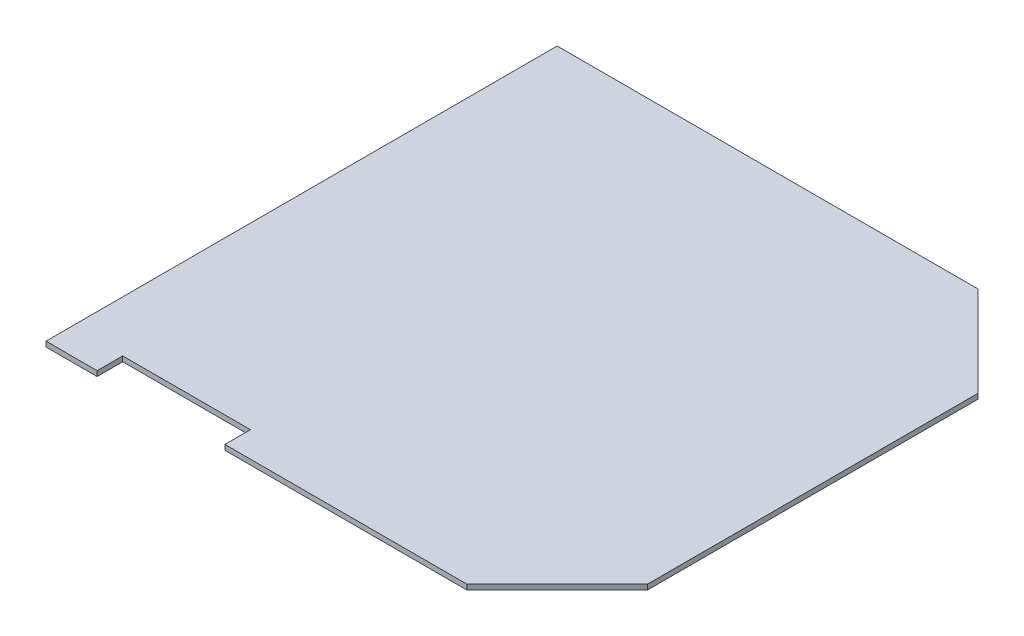
ISO-10303-21;
HEADER;
FILE_DESCRIPTION(('STEP AP214'),'2;1');
FILE_NAME('part.step','',(''),(''),'','','');
FILE_SCHEMA(('AUTOMOTIVE_DESIGN { 1 0 10303 214 1 1 1 1 }'));
ENDSEC;
DATA;
#1=APPLICATION_CONTEXT('core data for automotive mechanical design processes');
#2=APPLICATION_PROTOCOL_DEFINITION('international standard','automotive_design',2000,#1);
#3=PRODUCT_CONTEXT('',#1,'mechanical');
#4=PRODUCT('Part','Part','',(#3));
#5=PRODUCT_RELATED_PRODUCT_CATEGORY('part','',(#4));
#6=PRODUCT_DEFINITION_FORMATION('','',#4);
#7=PRODUCT_DEFINITION_CONTEXT('part definition',#1,'design');
#8=PRODUCT_DEFINITION('design','',#6,#7);
#9=PRODUCT_DEFINITION_SHAPE('','',#8);
#10=(LENGTH_UNIT() NAMED_UNIT(*) SI_UNIT(.MILLI.,.METRE.));
#11=(NAMED_UNIT(*) PLANE_ANGLE_UNIT() SI_UNIT($,.RADIAN.));
#12=(NAMED_UNIT(*) SI_UNIT($,.STERADIAN.) SOLID_ANGLE_UNIT());
#13=UNCERTAINTY_MEASURE_WITH_UNIT(LENGTH_MEASURE(1.E-05),#10,'distance_accuracy_value','');
#14=(GEOMETRIC_REPRESENTATION_CONTEXT(3) GLOBAL_UNCERTAINTY_ASSIGNED_CONTEXT((#13)) GLOBAL_UNIT_ASSIGNED_CONTEXT((#10,
#11,#12)) REPRESENTATION_CONTEXT('',''));
#15=CARTESIAN_POINT('',(0.,0.,0.));
#16=DIRECTION('',(0.,0.,1.));
#17=DIRECTION('',(1.,0.,0.));
#18=AXIS2_PLACEMENT_3D('',#15,#16,#17);
#19=CARTESIAN_POINT('',(-82.3223304703363,2.,100.));
#20=DIRECTION('',(0.,0.,-1.));
#21=DIRECTION('',(-1.,0.,0.));
#22=AXIS2_PLACEMENT_3D('',#19,#20,#21);
#23=PLANE('',#22);
#24=DIRECTION('',(1.,0.,0.));
#25=VECTOR('',#24,1.);
#26=CARTESIAN_POINT('',(-82.3223304703363,0.,100.));
#27=LINE('',#26,#25);
#28=CARTESIAN_POINT('',(-82.3223304703363,0.,100.));
#29=VERTEX_POINT('',#28);
#30=CARTESIAN_POINT('',(-62.3223304703363,0.,100.));
#31=VERTEX_POINT('',#30);
#32=EDGE_CURVE('E148',#29,#31,#27,.T.);
#33=ORIENTED_EDGE('',*,*,#32,.T.);
#34=DIRECTION('',(0.,1.,0.));
#35=VECTOR('',#34,1.);
#36=CARTESIAN_POINT('',(-62.3223304703363,0.,100.));
#37=LINE('',#36,#35);
#38=CARTESIAN_POINT('',(-62.3223304703363,2.,100.));
#39=VERTEX_POINT('',#38);
#40=EDGE_CURVE('E193',#31,#39,#37,.T.);
#41=ORIENTED_EDGE('',*,*,#40,.T.);
#42=DIRECTION('',(1.,0.,0.));
#43=VECTOR('',#42,1.);
#44=CARTESIAN_POINT('',(-82.3223304703363,2.,100.));
#45=LINE('',#44,#43);
#46=CARTESIAN_POINT('',(-82.3223304703363,2.,100.));
#47=VERTEX_POINT('',#46);
#48=EDGE_CURVE('E99',#47,#39,#45,.T.);
#49=ORIENTED_EDGE('',*,*,#48,.F.);
#50=DIRECTION('',(0.,-1.,0.));
#51=VECTOR('',#50,1.);
#52=CARTESIAN_POINT('',(-82.3223304703363,2.,100.));
#53=LINE('',#52,#51);
#54=EDGE_CURVE('E11',#47,#29,#53,.T.);
#55=ORIENTED_EDGE('',*,*,#54,.T.);
#56=EDGE_LOOP('',(#33,#41,#49,#55));
#57=FACE_BOUND('',#56,.T.);
#58=ADVANCED_FACE('F39',(#57),#23,.F.);
#59=CARTESIAN_POINT('',(-82.3223304703363,2.,100.));
#60=DIRECTION('',(1.,0.,0.));
#61=DIRECTION('',(0.,0.,-1.));
#62=AXIS2_PLACEMENT_3D('',#59,#60,#61);
#63=PLANE('',#62);
#64=DIRECTION('',(0.,0.,1.));
#65=VECTOR('',#64,1.);
#66=CARTESIAN_POINT('',(-82.3223304703363,0.,100.));
#67=LINE('',#66,#65);
#68=CARTESIAN_POINT('',(-82.3223304703363,0.,-100.));
#69=VERTEX_POINT('',#68);
#70=EDGE_CURVE('E142',#69,#29,#67,.T.);
#71=ORIENTED_EDGE('',*,*,#70,.T.);
#72=ORIENTED_EDGE('',*,*,#54,.F.);
#73=DIRECTION('',(0.,0.,1.));
#74=VECTOR('',#73,1.);
#75=CARTESIAN_POINT('',(-82.3223304703363,2.,100.));
#76=LINE('',#75,#74);
#77=CARTESIAN_POINT('',(-82.3223304703363,2.,-100.));
#78=VERTEX_POINT('',#77);
#79=EDGE_CURVE('E162',#78,#47,#76,.T.);
#80=ORIENTED_EDGE('',*,*,#79,.F.);
#81=DIRECTION('',(0.,-1.,0.));
#82=VECTOR('',#81,1.);
#83=CARTESIAN_POINT('',(-82.3223304703363,2.,-100.));
#84=LINE('',#83,#82);
#85=EDGE_CURVE('E138',#78,#69,#84,.T.);
#86=ORIENTED_EDGE('',*,*,#85,.T.);
#87=EDGE_LOOP('',(#71,#72,#80,#86));
#88=FACE_BOUND('',#87,.T.);
#89=ADVANCED_FACE('F41',(#88),#63,.F.);
#90=CARTESIAN_POINT('',(-12.3223304703363,2.,100.));
#91=VERTEX_POINT('',#90);
#92=CARTESIAN_POINT('',(82.3223304703364,2.,100.));
#93=VERTEX_POINT('',#92);
#94=EDGE_CURVE('E188',#91,#93,#45,.T.);
#95=ORIENTED_EDGE('',*,*,#94,.F.);
#96=DIRECTION('',(0.,1.,0.));
#97=VECTOR('',#96,1.);
#98=CARTESIAN_POINT('',(-12.3223304703363,0.,100.));
#99=LINE('',#98,#97);
#100=CARTESIAN_POINT('',(-12.3223304703363,0.,100.));
#101=VERTEX_POINT('',#100);
#102=EDGE_CURVE('E234',#101,#91,#99,.T.);
#103=ORIENTED_EDGE('',*,*,#102,.F.);
#104=CARTESIAN_POINT('',(82.3223304703364,0.,100.));
#105=VERTEX_POINT('',#104);
#106=EDGE_CURVE('E146',#101,#105,#27,.T.);
#107=ORIENTED_EDGE('',*,*,#106,.T.);
#108=DIRECTION('',(0.,-1.,0.));
#109=VECTOR('',#108,1.);
#110=CARTESIAN_POINT('',(82.3223304703364,2.,100.));
#111=LINE('',#110,#109);
#112=EDGE_CURVE('E48',#93,#105,#111,.T.);
#113=ORIENTED_EDGE('',*,*,#112,.F.);
#114=EDGE_LOOP('',(#95,#103,#107,#113));
#115=FACE_BOUND('',#114,.T.);
#116=ADVANCED_FACE('F248',(#115),#23,.F.);
#117=CARTESIAN_POINT('',(117.677669529664,2.,64.6446609406727));
#118=DIRECTION('',(-0.707106781186547,0.,-0.707106781186549));
#119=DIRECTION('',(-0.707106781186549,0.,0.707106781186546));
#120=AXIS2_PLACEMENT_3D('',#117,#118,#119);
#121=PLANE('',#120);
#122=DIRECTION('',(0.707106781186548,0.,-0.707106781186546));
#123=VECTOR('',#122,1.);
#124=CARTESIAN_POINT('',(117.677669529664,0.,64.6446609406727));
#125=LINE('',#124,#123);
#126=CARTESIAN_POINT('',(117.677669529664,0.,64.6446609406727));
#127=VERTEX_POINT('',#126);
#128=EDGE_CURVE('E152',#105,#127,#125,.T.);
#129=ORIENTED_EDGE('',*,*,#128,.T.);
#130=DIRECTION('',(0.,-1.,0.));
#131=VECTOR('',#130,1.);
#132=CARTESIAN_POINT('',(117.677669529664,2.,64.6446609406727));
#133=LINE('',#132,#131);
#134=CARTESIAN_POINT('',(117.677669529664,2.,64.6446609406727));
#135=VERTEX_POINT('',#134);
#136=EDGE_CURVE('E131',#135,#127,#133,.T.);
#137=ORIENTED_EDGE('',*,*,#136,.F.);
#138=DIRECTION('',(0.707106781186548,0.,-0.707106781186546));
#139=VECTOR('',#138,1.);
#140=CARTESIAN_POINT('',(117.677669529664,2.,64.6446609406727));
#141=LINE('',#140,#139);
#142=EDGE_CURVE('E117',#93,#135,#141,.T.);
#143=ORIENTED_EDGE('',*,*,#142,.F.);
#144=ORIENTED_EDGE('',*,*,#112,.T.);
#145=EDGE_LOOP('',(#129,#137,#143,#144));
#146=FACE_BOUND('',#145,.T.);
#147=ADVANCED_FACE('F173',(#146),#121,.F.);
#148=CARTESIAN_POINT('',(117.677669529664,2.,-64.6446609406727));
#149=DIRECTION('',(-1.,0.,0.));
#150=DIRECTION('',(0.,0.,1.));
#151=AXIS2_PLACEMENT_3D('',#148,#149,#150);
#152=PLANE('',#151);
#153=DIRECTION('',(0.,0.,-1.));
#154=VECTOR('',#153,1.);
#155=CARTESIAN_POINT('',(117.677669529664,0.,-64.6446609406727));
#156=LINE('',#155,#154);
#157=CARTESIAN_POINT('',(117.677669529664,0.,-64.6446609406727));
#158=VERTEX_POINT('',#157);
#159=EDGE_CURVE('E127',#127,#158,#156,.T.);
#160=ORIENTED_EDGE('',*,*,#159,.T.);
#161=DIRECTION('',(0.,-1.,0.));
#162=VECTOR('',#161,1.);
#163=CARTESIAN_POINT('',(117.677669529664,2.,-64.6446609406727));
#164=LINE('',#163,#162);
#165=CARTESIAN_POINT('',(117.677669529664,2.,-64.6446609406727));
#166=VERTEX_POINT('',#165);
#167=EDGE_CURVE('E124',#166,#158,#164,.T.);
#168=ORIENTED_EDGE('',*,*,#167,.F.);
#169=DIRECTION('',(0.,0.,-1.));
#170=VECTOR('',#169,1.);
#171=CARTESIAN_POINT('',(117.677669529664,2.,-64.6446609406727));
#172=LINE('',#171,#170);
#173=EDGE_CURVE('E110',#135,#166,#172,.T.);
#174=ORIENTED_EDGE('',*,*,#173,.F.);
#175=ORIENTED_EDGE('',*,*,#136,.T.);
#176=EDGE_LOOP('',(#160,#168,#174,#175));
#177=FACE_BOUND('',#176,.T.);
#178=ADVANCED_FACE('F125',(#177),#152,.F.);
#179=CARTESIAN_POINT('',(82.3223304703363,2.,-100.));
#180=DIRECTION('',(-0.707106781186546,0.,0.707106781186549));
#181=DIRECTION('',(0.707106781186549,0.,0.707106781186546));
#182=AXIS2_PLACEMENT_3D('',#179,#180,#181);
#183=PLANE('',#182);
#184=DIRECTION('',(-0.707106781186549,0.,-0.707106781186546));
#185=VECTOR('',#184,1.);
#186=CARTESIAN_POINT('',(82.3223304703363,0.,-100.));
#187=LINE('',#186,#185);
#188=CARTESIAN_POINT('',(82.3223304703363,0.,-100.));
#189=VERTEX_POINT('',#188);
#190=EDGE_CURVE('E157',#158,#189,#187,.T.);
#191=ORIENTED_EDGE('',*,*,#190,.T.);
#192=DIRECTION('',(0.,-1.,0.));
#193=VECTOR('',#192,1.);
#194=CARTESIAN_POINT('',(82.3223304703363,2.,-100.));
#195=LINE('',#194,#193);
#196=CARTESIAN_POINT('',(82.3223304703363,2.,-100.));
#197=VERTEX_POINT('',#196);
#198=EDGE_CURVE('E132',#197,#189,#195,.T.);
#199=ORIENTED_EDGE('',*,*,#198,.F.);
#200=DIRECTION('',(-0.707106781186549,0.,-0.707106781186546));
#201=VECTOR('',#200,1.);
#202=CARTESIAN_POINT('',(82.3223304703363,2.,-100.));
#203=LINE('',#202,#201);
#204=EDGE_CURVE('E114',#166,#197,#203,.T.);
#205=ORIENTED_EDGE('',*,*,#204,.F.);
#206=ORIENTED_EDGE('',*,*,#167,.T.);
#207=EDGE_LOOP('',(#191,#199,#205,#206));
#208=FACE_BOUND('',#207,.T.);
#209=ADVANCED_FACE('F134',(#208),#183,.F.);
#210=CARTESIAN_POINT('',(-82.3223304703363,2.,-100.));
#211=DIRECTION('',(0.,0.,1.));
#212=DIRECTION('',(1.,0.,0.));
#213=AXIS2_PLACEMENT_3D('',#210,#211,#212);
#214=PLANE('',#213);
#215=DIRECTION('',(-1.,0.,0.));
#216=VECTOR('',#215,1.);
#217=CARTESIAN_POINT('',(-82.3223304703363,0.,-100.));
#218=LINE('',#217,#216);
#219=EDGE_CURVE('E91',#189,#69,#218,.T.);
#220=ORIENTED_EDGE('',*,*,#219,.T.);
#221=ORIENTED_EDGE('',*,*,#85,.F.);
#222=DIRECTION('',(-1.,0.,0.));
#223=VECTOR('',#222,1.);
#224=CARTESIAN_POINT('',(-82.3223304703363,2.,-100.));
#225=LINE('',#224,#223);
#226=EDGE_CURVE('E64',#197,#78,#225,.T.);
#227=ORIENTED_EDGE('',*,*,#226,.F.);
#228=ORIENTED_EDGE('',*,*,#198,.T.);
#229=EDGE_LOOP('',(#220,#221,#227,#228));
#230=FACE_BOUND('',#229,.T.);
#231=ADVANCED_FACE('F183',(#230),#214,.F.);
#232=CARTESIAN_POINT('',(0.,2.,0.));
#233=DIRECTION('',(0.,-1.,0.));
#234=DIRECTION('',(0.,0.,-1.));
#235=AXIS2_PLACEMENT_3D('',#232,#233,#234);
#236=PLANE('',#235);
#237=ORIENTED_EDGE('',*,*,#48,.T.);
#238=DIRECTION('',(0.,0.,1.));
#239=VECTOR('',#238,1.);
#240=CARTESIAN_POINT('',(-62.3223304703363,2.,100.));
#241=LINE('',#240,#239);
#242=CARTESIAN_POINT('',(-62.3223304703363,2.,90.));
#243=VERTEX_POINT('',#242);
#244=EDGE_CURVE('E201',#243,#39,#241,.T.);
#245=ORIENTED_EDGE('',*,*,#244,.F.);
#246=DIRECTION('',(-1.,0.,0.));
#247=VECTOR('',#246,1.);
#248=CARTESIAN_POINT('',(-62.3223304703363,2.,90.));
#249=LINE('',#248,#247);
#250=CARTESIAN_POINT('',(-12.3223304703363,2.,90.));
#251=VERTEX_POINT('',#250);
#252=EDGE_CURVE('E223',#251,#243,#249,.T.);
#253=ORIENTED_EDGE('',*,*,#252,.F.);
#254=DIRECTION('',(0.,0.,-1.));
#255=VECTOR('',#254,1.);
#256=CARTESIAN_POINT('',(-12.3223304703363,2.,100.));
#257=LINE('',#256,#255);
#258=EDGE_CURVE('E239',#91,#251,#257,.T.);
#259=ORIENTED_EDGE('',*,*,#258,.F.);
#260=ORIENTED_EDGE('',*,*,#94,.T.);
#261=ORIENTED_EDGE('',*,*,#142,.T.);
#262=ORIENTED_EDGE('',*,*,#173,.T.);
#263=ORIENTED_EDGE('',*,*,#204,.T.);
#264=ORIENTED_EDGE('',*,*,#226,.T.);
#265=ORIENTED_EDGE('',*,*,#79,.T.);
#266=EDGE_LOOP('',(#237,#245,#253,#259,#260,#261,#262,#263,#264,#265));
#267=FACE_BOUND('',#266,.T.);
#268=ADVANCED_FACE('F112',(#267),#236,.F.);
#269=CARTESIAN_POINT('',(0.,0.,0.));
#270=DIRECTION('',(0.,-1.,0.));
#271=DIRECTION('',(0.,0.,-1.));
#272=AXIS2_PLACEMENT_3D('',#269,#270,#271);
#273=PLANE('',#272);
#274=DIRECTION('',(0.,0.,1.));
#275=VECTOR('',#274,1.);
#276=CARTESIAN_POINT('',(-62.3223304703363,0.,100.));
#277=LINE('',#276,#275);
#278=CARTESIAN_POINT('',(-62.3223304703363,0.,90.));
#279=VERTEX_POINT('',#278);
#280=EDGE_CURVE('E226',#279,#31,#277,.T.);
#281=ORIENTED_EDGE('',*,*,#280,.T.);
#282=ORIENTED_EDGE('',*,*,#32,.F.);
#283=ORIENTED_EDGE('',*,*,#70,.F.);
#284=ORIENTED_EDGE('',*,*,#219,.F.);
#285=ORIENTED_EDGE('',*,*,#190,.F.);
#286=ORIENTED_EDGE('',*,*,#159,.F.);
#287=ORIENTED_EDGE('',*,*,#128,.F.);
#288=ORIENTED_EDGE('',*,*,#106,.F.);
#289=DIRECTION('',(0.,0.,-1.));
#290=VECTOR('',#289,1.);
#291=CARTESIAN_POINT('',(-12.3223304703363,0.,100.));
#292=LINE('',#291,#290);
#293=CARTESIAN_POINT('',(-12.3223304703363,0.,90.));
#294=VERTEX_POINT('',#293);
#295=EDGE_CURVE('E220',#101,#294,#292,.T.);
#296=ORIENTED_EDGE('',*,*,#295,.T.);
#297=DIRECTION('',(-1.,0.,0.));
#298=VECTOR('',#297,1.);
#299=CARTESIAN_POINT('',(-62.3223304703363,0.,90.));
#300=LINE('',#299,#298);
#301=EDGE_CURVE('E55',#294,#279,#300,.T.);
#302=ORIENTED_EDGE('',*,*,#301,.T.);
#303=EDGE_LOOP('',(#281,#282,#283,#284,#285,#286,#287,#288,#296,#302));
#304=FACE_BOUND('',#303,.T.);
#305=ADVANCED_FACE('F179',(#304),#273,.T.);
#306=CARTESIAN_POINT('',(-62.3223304703363,0.,100.));
#307=DIRECTION('',(-1.,0.,0.));
#308=DIRECTION('',(0.,0.,1.));
#309=AXIS2_PLACEMENT_3D('',#306,#307,#308);
#310=PLANE('',#309);
#311=ORIENTED_EDGE('',*,*,#244,.T.);
#312=ORIENTED_EDGE('',*,*,#40,.F.);
#313=ORIENTED_EDGE('',*,*,#280,.F.);
#314=DIRECTION('',(0.,1.,0.));
#315=VECTOR('',#314,1.);
#316=CARTESIAN_POINT('',(-62.3223304703363,0.,90.));
#317=LINE('',#316,#315);
#318=EDGE_CURVE('E147',#279,#243,#317,.T.);
#319=ORIENTED_EDGE('',*,*,#318,.T.);
#320=EDGE_LOOP('',(#311,#312,#313,#319));
#321=FACE_BOUND('',#320,.T.);
#322=ADVANCED_FACE('F227',(#321),#310,.F.);
#323=CARTESIAN_POINT('',(-62.3223304703363,0.,90.));
#324=DIRECTION('',(0.,0.,-1.));
#325=DIRECTION('',(-1.,0.,0.));
#326=AXIS2_PLACEMENT_3D('',#323,#324,#325);
#327=PLANE('',#326);
#328=ORIENTED_EDGE('',*,*,#252,.T.);
#329=ORIENTED_EDGE('',*,*,#318,.F.);
#330=ORIENTED_EDGE('',*,*,#301,.F.);
#331=DIRECTION('',(0.,1.,0.));
#332=VECTOR('',#331,1.);
#333=CARTESIAN_POINT('',(-12.3223304703363,0.,90.));
#334=LINE('',#333,#332);
#335=EDGE_CURVE('E213',#294,#251,#334,.T.);
#336=ORIENTED_EDGE('',*,*,#335,.T.);
#337=EDGE_LOOP('',(#328,#329,#330,#336));
#338=FACE_BOUND('',#337,.T.);
#339=ADVANCED_FACE('F222',(#338),#327,.F.);
#340=CARTESIAN_POINT('',(-12.3223304703363,0.,100.));
#341=DIRECTION('',(1.,0.,0.));
#342=DIRECTION('',(0.,0.,-1.));
#343=AXIS2_PLACEMENT_3D('',#340,#341,#342);
#344=PLANE('',#343);
#345=ORIENTED_EDGE('',*,*,#258,.T.);
#346=ORIENTED_EDGE('',*,*,#335,.F.);
#347=ORIENTED_EDGE('',*,*,#295,.F.);
#348=ORIENTED_EDGE('',*,*,#102,.T.);
#349=EDGE_LOOP('',(#345,#346,#347,#348));
#350=FACE_BOUND('',#349,.T.);
#351=ADVANCED_FACE('F247',(#350),#344,.F.);
#352=CLOSED_SHELL('',(#58,#89,#116,#147,#178,#209,#231,#268,#305,#322,#339,#351));
#353=MANIFOLD_SOLID_BREP('B2',#352);
#354=ADVANCED_BREP_SHAPE_REPRESENTATION('',(#18,#353),#14);
#355=SHAPE_DEFINITION_REPRESENTATION(#9,#354);
ENDSEC;
END-ISO-10303-21;
